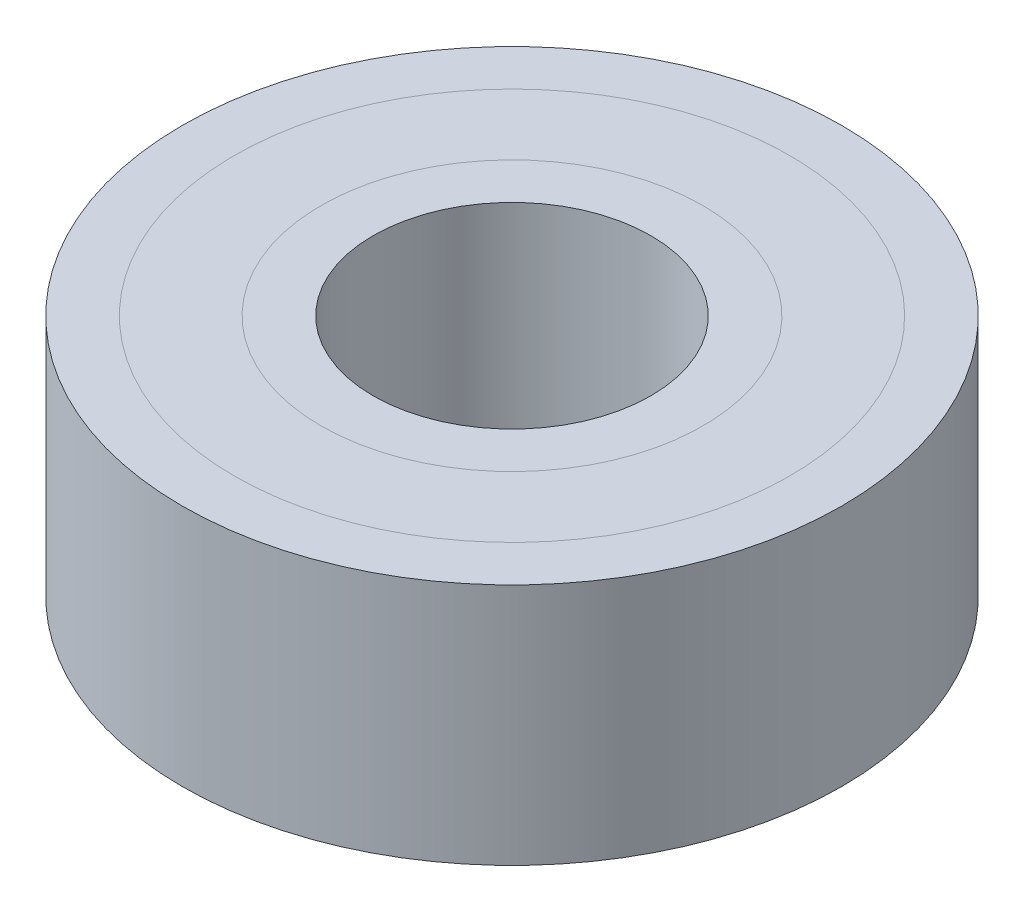
ISO-10303-21;
HEADER;
FILE_DESCRIPTION(('STEP AP214'),'2;1');
FILE_NAME('part.step','',(''),(''),'','','');
FILE_SCHEMA(('AUTOMOTIVE_DESIGN { 1 0 10303 214 1 1 1 1 }'));
ENDSEC;
DATA;
#1=APPLICATION_CONTEXT('core data for automotive mechanical design processes');
#2=APPLICATION_PROTOCOL_DEFINITION('international standard','automotive_design',2000,#1);
#3=PRODUCT_CONTEXT('',#1,'mechanical');
#4=PRODUCT('Part','Part','',(#3));
#5=PRODUCT_RELATED_PRODUCT_CATEGORY('part','',(#4));
#6=PRODUCT_DEFINITION_FORMATION('','',#4);
#7=PRODUCT_DEFINITION_CONTEXT('part definition',#1,'design');
#8=PRODUCT_DEFINITION('design','',#6,#7);
#9=PRODUCT_DEFINITION_SHAPE('','',#8);
#10=(LENGTH_UNIT() NAMED_UNIT(*) SI_UNIT(.MILLI.,.METRE.));
#11=(NAMED_UNIT(*) PLANE_ANGLE_UNIT() SI_UNIT($,.RADIAN.));
#12=(NAMED_UNIT(*) SI_UNIT($,.STERADIAN.) SOLID_ANGLE_UNIT());
#13=UNCERTAINTY_MEASURE_WITH_UNIT(LENGTH_MEASURE(1.E-05),#10,'distance_accuracy_value','');
#14=(GEOMETRIC_REPRESENTATION_CONTEXT(3) GLOBAL_UNCERTAINTY_ASSIGNED_CONTEXT((#13)) GLOBAL_UNIT_ASSIGNED_CONTEXT((#10,
#11,#12)) REPRESENTATION_CONTEXT('',''));
#15=CARTESIAN_POINT('',(0.,0.,0.));
#16=DIRECTION('',(0.,0.,1.));
#17=DIRECTION('',(1.,0.,0.));
#18=AXIS2_PLACEMENT_3D('',#15,#16,#17);
#19=CARTESIAN_POINT('',(2.8315179554926,13.6323930132594,12.7276022142431));
#20=DIRECTION('',(0.,1.,0.));
#21=DIRECTION('',(0.,0.,1.));
#22=AXIS2_PLACEMENT_3D('',#19,#20,#21);
#23=PLANE('',#22);
#24=CARTESIAN_POINT('',(2.8315179554926,13.6323930132594,12.7276022142431));
#25=DIRECTION('',(0.,1.,0.));
#26=DIRECTION('',(0.,0.,1.));
#27=AXIS2_PLACEMENT_3D('',#24,#25,#26);
#28=CIRCLE('',#27,8.);
#29=CARTESIAN_POINT('',(2.8315179554926,13.6323930132594,20.7276022142431));
#30=VERTEX_POINT('',#29);
#31=EDGE_CURVE('P0_E10',#30,#30,#28,.T.);
#32=ORIENTED_EDGE('',*,*,#31,.T.);
#33=EDGE_LOOP('',(#32));
#34=FACE_BOUND('',#33,.T.);
#35=CARTESIAN_POINT('',(2.8315179554926,13.6323930132594,12.7276022142431));
#36=DIRECTION('',(0.,1.,0.));
#37=DIRECTION('',(0.,0.,1.));
#38=AXIS2_PLACEMENT_3D('',#35,#36,#37);
#39=CIRCLE('',#38,5.5);
#40=CARTESIAN_POINT('',(2.8315179554926,13.6323930132594,18.227602214243));
#41=VERTEX_POINT('',#40);
#42=EDGE_CURVE('P0_E26',#41,#41,#39,.T.);
#43=ORIENTED_EDGE('',*,*,#42,.F.);
#44=EDGE_LOOP('',(#43));
#45=FACE_BOUND('',#44,.T.);
#46=ADVANCED_FACE('P0_F15',(#34,#45),#23,.T.);
#47=CARTESIAN_POINT('',(2.8315179554926,6.6323930132594,12.7276022142431));
#48=DIRECTION('',(0.,1.,0.));
#49=DIRECTION('',(0.,0.,1.));
#50=AXIS2_PLACEMENT_3D('',#47,#48,#49);
#51=PLANE('',#50);
#52=CARTESIAN_POINT('',(2.8315179554926,6.6323930132594,12.7276022142431));
#53=DIRECTION('',(0.,1.,0.));
#54=DIRECTION('',(0.,0.,1.));
#55=AXIS2_PLACEMENT_3D('',#52,#53,#54);
#56=CIRCLE('',#55,8.);
#57=CARTESIAN_POINT('',(2.8315179554926,6.6323930132594,20.7276022142431));
#58=VERTEX_POINT('',#57);
#59=EDGE_CURVE('P0_E19',#58,#58,#56,.T.);
#60=ORIENTED_EDGE('',*,*,#59,.F.);
#61=EDGE_LOOP('',(#60));
#62=FACE_BOUND('',#61,.T.);
#63=CARTESIAN_POINT('',(2.8315179554926,6.6323930132594,12.7276022142431));
#64=DIRECTION('',(0.,1.,0.));
#65=DIRECTION('',(0.,0.,1.));
#66=AXIS2_PLACEMENT_3D('',#63,#64,#65);
#67=CIRCLE('',#66,5.5);
#68=CARTESIAN_POINT('',(2.8315179554926,6.6323930132594,18.227602214243));
#69=VERTEX_POINT('',#68);
#70=EDGE_CURVE('P0_E28',#69,#69,#67,.T.);
#71=ORIENTED_EDGE('',*,*,#70,.T.);
#72=EDGE_LOOP('',(#71));
#73=FACE_BOUND('',#72,.T.);
#74=ADVANCED_FACE('P0_F38',(#62,#73),#51,.F.);
#75=CARTESIAN_POINT('',(2.8315179554926,13.6323930132594,12.7276022142431));
#76=DIRECTION('',(0.,-1.,0.));
#77=DIRECTION('',(0.,0.,-1.));
#78=AXIS2_PLACEMENT_3D('',#75,#76,#77);
#79=CYLINDRICAL_SURFACE('',#78,8.);
#80=ORIENTED_EDGE('',*,*,#31,.F.);
#81=EDGE_LOOP('',(#80));
#82=FACE_BOUND('',#81,.T.);
#83=ORIENTED_EDGE('',*,*,#59,.T.);
#84=EDGE_LOOP('',(#83));
#85=FACE_BOUND('',#84,.T.);
#86=ADVANCED_FACE('P0_F17',(#82,#85),#79,.T.);
#87=CARTESIAN_POINT('',(2.8315179554926,13.6323930132594,12.7276022142431));
#88=DIRECTION('',(0.,-1.,0.));
#89=DIRECTION('',(0.,0.,-1.));
#90=AXIS2_PLACEMENT_3D('',#87,#88,#89);
#91=CYLINDRICAL_SURFACE('',#90,5.5);
#92=ORIENTED_EDGE('',*,*,#42,.T.);
#93=EDGE_LOOP('',(#92));
#94=FACE_BOUND('',#93,.T.);
#95=ORIENTED_EDGE('',*,*,#70,.F.);
#96=EDGE_LOOP('',(#95));
#97=FACE_BOUND('',#96,.T.);
#98=ADVANCED_FACE('P0_F34',(#94,#97),#91,.F.);
#99=CLOSED_SHELL('',(#46,#74,#86,#98));
#100=MANIFOLD_SOLID_BREP('P0_B1',#99);
#101=CARTESIAN_POINT('',(2.8315179554926,13.6323930132594,12.7276022142431));
#102=DIRECTION('',(0.,-1.,0.));
#103=DIRECTION('',(0.,0.,-1.));
#104=AXIS2_PLACEMENT_3D('',#101,#102,#103);
#105=CYLINDRICAL_SURFACE('',#104,4.);
#106=CARTESIAN_POINT('',(2.8315179554926,13.6323930132594,12.7276022142431));
#107=DIRECTION('',(0.,1.,0.));
#108=DIRECTION('',(0.,0.,1.));
#109=AXIS2_PLACEMENT_3D('',#106,#107,#108);
#110=CIRCLE('',#109,4.);
#111=CARTESIAN_POINT('',(2.8315179554926,13.6323930132594,16.7276022142431));
#112=VERTEX_POINT('',#111);
#113=EDGE_CURVE('P1_E22',#112,#112,#110,.T.);
#114=ORIENTED_EDGE('',*,*,#113,.T.);
#115=EDGE_LOOP('',(#114));
#116=FACE_BOUND('',#115,.T.);
#117=CARTESIAN_POINT('',(2.8315179554926,6.6323930132594,12.7276022142431));
#118=DIRECTION('',(0.,1.,0.));
#119=DIRECTION('',(0.,0.,1.));
#120=AXIS2_PLACEMENT_3D('',#117,#118,#119);
#121=CIRCLE('',#120,4.);
#122=CARTESIAN_POINT('',(2.8315179554926,6.6323930132594,16.7276022142431));
#123=VERTEX_POINT('',#122);
#124=EDGE_CURVE('P1_E28',#123,#123,#121,.T.);
#125=ORIENTED_EDGE('',*,*,#124,.F.);
#126=EDGE_LOOP('',(#125));
#127=FACE_BOUND('',#126,.T.);
#128=ADVANCED_FACE('P1_F15',(#116,#127),#105,.F.);
#129=CARTESIAN_POINT('',(2.8315179554926,13.6323930132594,12.7276022142431));
#130=DIRECTION('',(0.,-1.,0.));
#131=DIRECTION('',(0.,0.,-1.));
#132=AXIS2_PLACEMENT_3D('',#129,#130,#131);
#133=CYLINDRICAL_SURFACE('',#132,5.5);
#134=CARTESIAN_POINT('',(2.8315179554926,13.6323930132594,12.7276022142431));
#135=DIRECTION('',(0.,1.,0.));
#136=DIRECTION('',(0.,0.,1.));
#137=AXIS2_PLACEMENT_3D('',#134,#135,#136);
#138=CIRCLE('',#137,5.5);
#139=CARTESIAN_POINT('',(2.8315179554926,13.6323930132594,18.227602214243));
#140=VERTEX_POINT('',#139);
#141=EDGE_CURVE('P1_E10',#140,#140,#138,.T.);
#142=ORIENTED_EDGE('',*,*,#141,.F.);
#143=EDGE_LOOP('',(#142));
#144=FACE_BOUND('',#143,.T.);
#145=CARTESIAN_POINT('',(2.8315179554926,6.6323930132594,12.7276022142431));
#146=DIRECTION('',(0.,1.,0.));
#147=DIRECTION('',(0.,0.,1.));
#148=AXIS2_PLACEMENT_3D('',#145,#146,#147);
#149=CIRCLE('',#148,5.5);
#150=CARTESIAN_POINT('',(2.8315179554926,6.6323930132594,18.227602214243));
#151=VERTEX_POINT('',#150);
#152=EDGE_CURVE('P1_E18',#151,#151,#149,.T.);
#153=ORIENTED_EDGE('',*,*,#152,.T.);
#154=EDGE_LOOP('',(#153));
#155=FACE_BOUND('',#154,.T.);
#156=ADVANCED_FACE('P1_F35',(#144,#155),#133,.T.);
#157=CARTESIAN_POINT('',(2.8315179554926,13.6323930132594,12.7276022142431));
#158=DIRECTION('',(0.,1.,0.));
#159=DIRECTION('',(0.,0.,1.));
#160=AXIS2_PLACEMENT_3D('',#157,#158,#159);
#161=PLANE('',#160);
#162=ORIENTED_EDGE('',*,*,#113,.F.);
#163=EDGE_LOOP('',(#162));
#164=FACE_BOUND('',#163,.T.);
#165=ORIENTED_EDGE('',*,*,#141,.T.);
#166=EDGE_LOOP('',(#165));
#167=FACE_BOUND('',#166,.T.);
#168=ADVANCED_FACE('P1_F39',(#164,#167),#161,.T.);
#169=CARTESIAN_POINT('',(2.8315179554926,6.6323930132594,12.7276022142431));
#170=DIRECTION('',(0.,1.,0.));
#171=DIRECTION('',(0.,0.,1.));
#172=AXIS2_PLACEMENT_3D('',#169,#170,#171);
#173=PLANE('',#172);
#174=ORIENTED_EDGE('',*,*,#124,.T.);
#175=EDGE_LOOP('',(#174));
#176=FACE_BOUND('',#175,.T.);
#177=ORIENTED_EDGE('',*,*,#152,.F.);
#178=EDGE_LOOP('',(#177));
#179=FACE_BOUND('',#178,.T.);
#180=ADVANCED_FACE('P1_F37',(#176,#179),#173,.F.);
#181=CLOSED_SHELL('',(#128,#156,#168,#180));
#182=MANIFOLD_SOLID_BREP('P1_B1',#181);
#183=CARTESIAN_POINT('',(2.8315179554926,13.6323930132594,12.7276022142431));
#184=DIRECTION('',(0.,-1.,0.));
#185=DIRECTION('',(0.,0.,-1.));
#186=AXIS2_PLACEMENT_3D('',#183,#184,#185);
#187=CYLINDRICAL_SURFACE('',#186,8.);
#188=CARTESIAN_POINT('',(2.8315179554926,13.6323930132594,12.7276022142431));
#189=DIRECTION('',(0.,1.,0.));
#190=DIRECTION('',(0.,0.,1.));
#191=AXIS2_PLACEMENT_3D('',#188,#189,#190);
#192=CIRCLE('',#191,8.);
#193=CARTESIAN_POINT('',(2.8315179554926,13.6323930132594,20.7276022142431));
#194=VERTEX_POINT('',#193);
#195=EDGE_CURVE('P2_E21',#194,#194,#192,.T.);
#196=ORIENTED_EDGE('',*,*,#195,.T.);
#197=EDGE_LOOP('',(#196));
#198=FACE_BOUND('',#197,.T.);
#199=CARTESIAN_POINT('',(2.8315179554926,6.6323930132594,12.7276022142431));
#200=DIRECTION('',(0.,1.,0.));
#201=DIRECTION('',(0.,0.,1.));
#202=AXIS2_PLACEMENT_3D('',#199,#200,#201);
#203=CIRCLE('',#202,8.);
#204=CARTESIAN_POINT('',(2.8315179554926,6.6323930132594,20.7276022142431));
#205=VERTEX_POINT('',#204);
#206=EDGE_CURVE('P2_E27',#205,#205,#203,.T.);
#207=ORIENTED_EDGE('',*,*,#206,.F.);
#208=EDGE_LOOP('',(#207));
#209=FACE_BOUND('',#208,.T.);
#210=ADVANCED_FACE('P2_F14',(#198,#209),#187,.F.);
#211=CARTESIAN_POINT('',(2.8315179554926,13.6323930132594,12.7276022142431));
#212=DIRECTION('',(0.,-1.,0.));
#213=DIRECTION('',(0.,0.,-1.));
#214=AXIS2_PLACEMENT_3D('',#211,#212,#213);
#215=CYLINDRICAL_SURFACE('',#214,9.5);
#216=CARTESIAN_POINT('',(2.8315179554926,13.6323930132594,12.7276022142431));
#217=DIRECTION('',(0.,1.,0.));
#218=DIRECTION('',(0.,0.,1.));
#219=AXIS2_PLACEMENT_3D('',#216,#217,#218);
#220=CIRCLE('',#219,9.5);
#221=CARTESIAN_POINT('',(2.8315179554926,13.6323930132594,22.2276022142431));
#222=VERTEX_POINT('',#221);
#223=EDGE_CURVE('P2_E9',#222,#222,#220,.T.);
#224=ORIENTED_EDGE('',*,*,#223,.F.);
#225=EDGE_LOOP('',(#224));
#226=FACE_BOUND('',#225,.T.);
#227=CARTESIAN_POINT('',(2.8315179554926,6.6323930132594,12.7276022142431));
#228=DIRECTION('',(0.,1.,0.));
#229=DIRECTION('',(0.,0.,1.));
#230=AXIS2_PLACEMENT_3D('',#227,#228,#229);
#231=CIRCLE('',#230,9.5);
#232=CARTESIAN_POINT('',(2.8315179554926,6.6323930132594,22.2276022142431));
#233=VERTEX_POINT('',#232);
#234=EDGE_CURVE('P2_E17',#233,#233,#231,.T.);
#235=ORIENTED_EDGE('',*,*,#234,.T.);
#236=EDGE_LOOP('',(#235));
#237=FACE_BOUND('',#236,.T.);
#238=ADVANCED_FACE('P2_F34',(#226,#237),#215,.T.);
#239=CARTESIAN_POINT('',(2.8315179554926,13.6323930132594,12.7276022142431));
#240=DIRECTION('',(0.,1.,0.));
#241=DIRECTION('',(0.,0.,1.));
#242=AXIS2_PLACEMENT_3D('',#239,#240,#241);
#243=PLANE('',#242);
#244=ORIENTED_EDGE('',*,*,#195,.F.);
#245=EDGE_LOOP('',(#244));
#246=FACE_BOUND('',#245,.T.);
#247=ORIENTED_EDGE('',*,*,#223,.T.);
#248=EDGE_LOOP('',(#247));
#249=FACE_BOUND('',#248,.T.);
#250=ADVANCED_FACE('P2_F38',(#246,#249),#243,.T.);
#251=CARTESIAN_POINT('',(2.8315179554926,6.6323930132594,12.7276022142431));
#252=DIRECTION('',(0.,1.,0.));
#253=DIRECTION('',(0.,0.,1.));
#254=AXIS2_PLACEMENT_3D('',#251,#252,#253);
#255=PLANE('',#254);
#256=ORIENTED_EDGE('',*,*,#206,.T.);
#257=EDGE_LOOP('',(#256));
#258=FACE_BOUND('',#257,.T.);
#259=ORIENTED_EDGE('',*,*,#234,.F.);
#260=EDGE_LOOP('',(#259));
#261=FACE_BOUND('',#260,.T.);
#262=ADVANCED_FACE('P2_F36',(#258,#261),#255,.F.);
#263=CLOSED_SHELL('',(#210,#238,#250,#262));
#264=MANIFOLD_SOLID_BREP('P2_B1',#263);
#265=ADVANCED_BREP_SHAPE_REPRESENTATION('',(#18,#100,#182,#264),#14);
#266=SHAPE_DEFINITION_REPRESENTATION(#9,#265);
ENDSEC;
END-ISO-10303-21;
